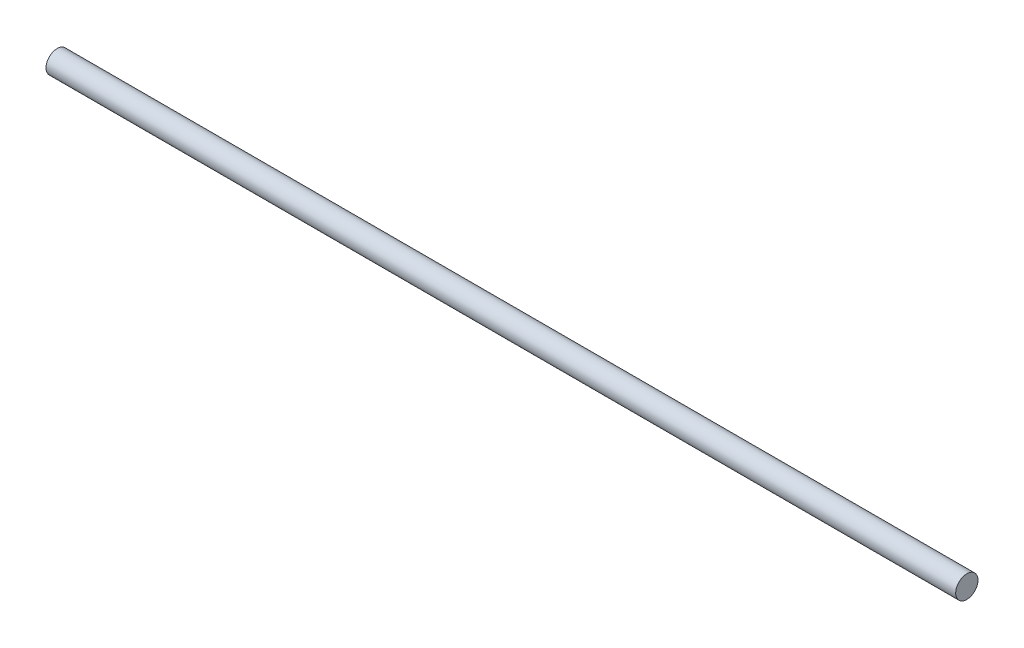
ISO-10303-21;
HEADER;
FILE_DESCRIPTION(('STEP AP214'),'2;1');
FILE_NAME('part.step','',(''),(''),'','','');
FILE_SCHEMA(('AUTOMOTIVE_DESIGN { 1 0 10303 214 1 1 1 1 }'));
ENDSEC;
DATA;
#1=APPLICATION_CONTEXT('core data for automotive mechanical design processes');
#2=APPLICATION_PROTOCOL_DEFINITION('international standard','automotive_design',2000,#1);
#3=PRODUCT_CONTEXT('',#1,'mechanical');
#4=PRODUCT('Part','Part','',(#3));
#5=PRODUCT_RELATED_PRODUCT_CATEGORY('part','',(#4));
#6=PRODUCT_DEFINITION_FORMATION('','',#4);
#7=PRODUCT_DEFINITION_CONTEXT('part definition',#1,'design');
#8=PRODUCT_DEFINITION('design','',#6,#7);
#9=PRODUCT_DEFINITION_SHAPE('','',#8);
#10=(LENGTH_UNIT() NAMED_UNIT(*) SI_UNIT(.MILLI.,.METRE.));
#11=(NAMED_UNIT(*) PLANE_ANGLE_UNIT() SI_UNIT($,.RADIAN.));
#12=(NAMED_UNIT(*) SI_UNIT($,.STERADIAN.) SOLID_ANGLE_UNIT());
#13=UNCERTAINTY_MEASURE_WITH_UNIT(LENGTH_MEASURE(1.E-05),#10,'distance_accuracy_value','');
#14=(GEOMETRIC_REPRESENTATION_CONTEXT(3) GLOBAL_UNCERTAINTY_ASSIGNED_CONTEXT((#13)) GLOBAL_UNIT_ASSIGNED_CONTEXT((#10,
#11,#12)) REPRESENTATION_CONTEXT('',''));
#15=CARTESIAN_POINT('',(0.,0.,0.));
#16=DIRECTION('',(0.,0.,1.));
#17=DIRECTION('',(1.,0.,0.));
#18=AXIS2_PLACEMENT_3D('',#15,#16,#17);
#19=CARTESIAN_POINT('',(163.,-1.13103970633688E-12,0.));
#20=DIRECTION('',(-1.,0.,0.));
#21=DIRECTION('',(0.,-1.,0.));
#22=AXIS2_PLACEMENT_3D('',#19,#20,#21);
#23=CYLINDRICAL_SURFACE('',#22,4.00000000000028);
#24=CARTESIAN_POINT('',(163.,-1.13103970633688E-12,0.));
#25=DIRECTION('',(-1.,0.,0.));
#26=DIRECTION('',(0.,-1.,0.));
#27=AXIS2_PLACEMENT_3D('',#24,#25,#26);
#28=CIRCLE('',#27,4.);
#29=CARTESIAN_POINT('',(163.,-4.00000000000113,0.));
#30=VERTEX_POINT('',#29);
#31=EDGE_CURVE('E10',#30,#30,#28,.T.);
#32=ORIENTED_EDGE('',*,*,#31,.T.);
#33=EDGE_LOOP('',(#32));
#34=FACE_BOUND('',#33,.T.);
#35=CARTESIAN_POINT('',(-163.,-5.65519853168439E-13,0.));
#36=DIRECTION('',(-1.,0.,0.));
#37=DIRECTION('',(0.,-1.,0.));
#38=AXIS2_PLACEMENT_3D('',#35,#36,#37);
#39=CIRCLE('',#38,4.00000000000057);
#40=CARTESIAN_POINT('',(-163.,-4.00000000000113,0.));
#41=VERTEX_POINT('',#40);
#42=EDGE_CURVE('E37',#41,#41,#39,.T.);
#43=ORIENTED_EDGE('',*,*,#42,.F.);
#44=EDGE_LOOP('',(#43));
#45=FACE_BOUND('',#44,.T.);
#46=ADVANCED_FACE('F31',(#34,#45),#23,.T.);
#47=CARTESIAN_POINT('',(163.,3.99999999999887,0.));
#48=DIRECTION('',(1.,0.,0.));
#49=DIRECTION('',(0.,1.,0.));
#50=AXIS2_PLACEMENT_3D('',#47,#48,#49);
#51=PLANE('',#50);
#52=ORIENTED_EDGE('',*,*,#31,.F.);
#53=EDGE_LOOP('',(#52));
#54=FACE_BOUND('',#53,.T.);
#55=ADVANCED_FACE('F46',(#54),#51,.T.);
#56=CARTESIAN_POINT('',(-163.,-5.65519853168439E-13,0.));
#57=DIRECTION('',(-1.,0.,0.));
#58=DIRECTION('',(0.,-1.,0.));
#59=AXIS2_PLACEMENT_3D('',#56,#57,#58);
#60=PLANE('',#59);
#61=ORIENTED_EDGE('',*,*,#42,.T.);
#62=EDGE_LOOP('',(#61));
#63=FACE_BOUND('',#62,.T.);
#64=ADVANCED_FACE('F43',(#63),#60,.T.);
#65=CLOSED_SHELL('',(#46,#55,#64));
#66=MANIFOLD_SOLID_BREP('B2',#65);
#67=ADVANCED_BREP_SHAPE_REPRESENTATION('',(#18,#66),#14);
#68=SHAPE_DEFINITION_REPRESENTATION(#9,#67);
ENDSEC;
END-ISO-10303-21;
